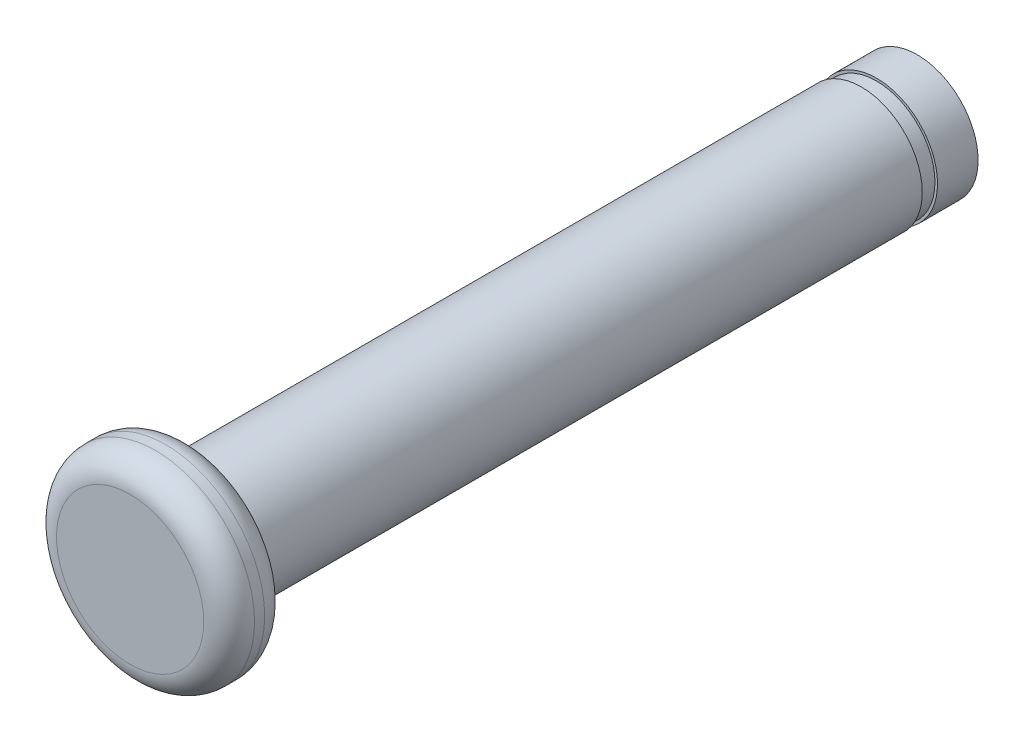
ISO-10303-21;
HEADER;
FILE_DESCRIPTION(('STEP AP214'),'2;1');
FILE_NAME('part.step','',(''),(''),'','','');
FILE_SCHEMA(('AUTOMOTIVE_DESIGN { 1 0 10303 214 1 1 1 1 }'));
ENDSEC;
DATA;
#1=APPLICATION_CONTEXT('core data for automotive mechanical design processes');
#2=APPLICATION_PROTOCOL_DEFINITION('international standard','automotive_design',2000,#1);
#3=PRODUCT_CONTEXT('',#1,'mechanical');
#4=PRODUCT('Part','Part','',(#3));
#5=PRODUCT_RELATED_PRODUCT_CATEGORY('part','',(#4));
#6=PRODUCT_DEFINITION_FORMATION('','',#4);
#7=PRODUCT_DEFINITION_CONTEXT('part definition',#1,'design');
#8=PRODUCT_DEFINITION('design','',#6,#7);
#9=PRODUCT_DEFINITION_SHAPE('','',#8);
#10=(LENGTH_UNIT() NAMED_UNIT(*) SI_UNIT(.MILLI.,.METRE.));
#11=(NAMED_UNIT(*) PLANE_ANGLE_UNIT() SI_UNIT($,.RADIAN.));
#12=(NAMED_UNIT(*) SI_UNIT($,.STERADIAN.) SOLID_ANGLE_UNIT());
#13=UNCERTAINTY_MEASURE_WITH_UNIT(LENGTH_MEASURE(1.E-05),#10,'distance_accuracy_value','');
#14=(GEOMETRIC_REPRESENTATION_CONTEXT(3) GLOBAL_UNCERTAINTY_ASSIGNED_CONTEXT((#13)) GLOBAL_UNIT_ASSIGNED_CONTEXT((#10,
#11,#12)) REPRESENTATION_CONTEXT('',''));
#15=CARTESIAN_POINT('',(0.,0.,0.));
#16=DIRECTION('',(0.,0.,1.));
#17=DIRECTION('',(1.,0.,0.));
#18=AXIS2_PLACEMENT_3D('',#15,#16,#17);
#19=CARTESIAN_POINT('',(0.,0.,-18.288));
#20=DIRECTION('',(0.,0.,-1.));
#21=DIRECTION('',(-1.,0.,0.));
#22=AXIS2_PLACEMENT_3D('',#19,#20,#21);
#23=PLANE('',#22);
#24=CARTESIAN_POINT('',(0.,0.,-18.288));
#25=DIRECTION('',(0.,0.,-1.));
#26=DIRECTION('',(-1.,0.,0.));
#27=AXIS2_PLACEMENT_3D('',#24,#25,#26);
#28=CIRCLE('',#27,1.524);
#29=CARTESIAN_POINT('',(-1.524,0.,-18.288));
#30=VERTEX_POINT('',#29);
#31=EDGE_CURVE('E53',#30,#30,#28,.T.);
#32=ORIENTED_EDGE('',*,*,#31,.T.);
#33=EDGE_LOOP('',(#32));
#34=FACE_BOUND('',#33,.T.);
#35=CARTESIAN_POINT('',(0.,0.,-18.288));
#36=DIRECTION('',(0.,0.,-1.));
#37=DIRECTION('',(-1.,0.,0.));
#38=AXIS2_PLACEMENT_3D('',#35,#36,#37);
#39=CIRCLE('',#38,1.4605);
#40=CARTESIAN_POINT('',(1.4605,0.,-18.288));
#41=VERTEX_POINT('',#40);
#42=EDGE_CURVE('E57',#41,#41,#39,.T.);
#43=ORIENTED_EDGE('',*,*,#42,.F.);
#44=EDGE_LOOP('',(#43));
#45=FACE_BOUND('',#44,.T.);
#46=ADVANCED_FACE('F30',(#34,#45),#23,.T.);
#47=CARTESIAN_POINT('',(0.,0.,-19.685));
#48=DIRECTION('',(0.,0.,1.));
#49=DIRECTION('',(1.,0.,0.));
#50=AXIS2_PLACEMENT_3D('',#47,#48,#49);
#51=CYLINDRICAL_SURFACE('',#50,1.524);
#52=CARTESIAN_POINT('',(0.,0.,-1.524));
#53=DIRECTION('',(0.,0.,1.));
#54=DIRECTION('',(1.,0.,0.));
#55=AXIS2_PLACEMENT_3D('',#52,#53,#54);
#56=CIRCLE('',#55,1.524);
#57=CARTESIAN_POINT('',(1.524,0.,-1.524));
#58=VERTEX_POINT('',#57);
#59=EDGE_CURVE('E50',#58,#58,#56,.F.);
#60=ORIENTED_EDGE('',*,*,#59,.T.);
#61=EDGE_LOOP('',(#60));
#62=FACE_BOUND('',#61,.T.);
#63=ORIENTED_EDGE('',*,*,#31,.F.);
#64=EDGE_LOOP('',(#63));
#65=FACE_BOUND('',#64,.T.);
#66=ADVANCED_FACE('F91',(#62,#65),#51,.T.);
#67=CARTESIAN_POINT('',(0.,0.,-1.524));
#68=DIRECTION('',(0.,0.,1.));
#69=DIRECTION('',(1.,0.,0.));
#70=AXIS2_PLACEMENT_3D('',#67,#68,#69);
#71=PLANE('',#70);
#72=CARTESIAN_POINT('',(0.,0.,-1.524));
#73=DIRECTION('',(0.,0.,1.));
#74=DIRECTION('',(1.,0.,0.));
#75=AXIS2_PLACEMENT_3D('',#72,#73,#74);
#76=CIRCLE('',#75,1.8415);
#77=CARTESIAN_POINT('',(1.8415,0.,-1.524));
#78=VERTEX_POINT('',#77);
#79=EDGE_CURVE('E10',#78,#78,#76,.F.);
#80=ORIENTED_EDGE('',*,*,#79,.T.);
#81=EDGE_LOOP('',(#80));
#82=FACE_BOUND('',#81,.T.);
#83=ORIENTED_EDGE('',*,*,#59,.F.);
#84=EDGE_LOOP('',(#83));
#85=FACE_BOUND('',#84,.T.);
#86=ADVANCED_FACE('F97',(#82,#85),#71,.F.);
#87=CARTESIAN_POINT('',(0.,0.,-1.524));
#88=DIRECTION('',(0.,0.,1.));
#89=DIRECTION('',(1.,0.,0.));
#90=AXIS2_PLACEMENT_3D('',#87,#88,#89);
#91=CYLINDRICAL_SURFACE('',#90,2.4765);
#92=CARTESIAN_POINT('',(0.,0.,-0.635));
#93=DIRECTION('',(0.,0.,1.));
#94=DIRECTION('',(1.,0.,0.));
#95=AXIS2_PLACEMENT_3D('',#92,#93,#94);
#96=CIRCLE('',#95,2.4765);
#97=CARTESIAN_POINT('',(2.4765,0.,-0.635));
#98=VERTEX_POINT('',#97);
#99=EDGE_CURVE('E37',#98,#98,#96,.F.);
#100=CARTESIAN_POINT('',(0.,0.,-0.889));
#101=DIRECTION('',(0.,0.,1.));
#102=DIRECTION('',(1.,0.,0.));
#103=AXIS2_PLACEMENT_3D('',#100,#101,#102);
#104=CIRCLE('',#103,2.4765);
#105=CARTESIAN_POINT('',(2.4765,0.,-0.889));
#106=VERTEX_POINT('',#105);
#107=EDGE_CURVE('E41',#106,#106,#104,.T.);
#108=CARTESIAN_POINT('',(2.4765,0.,-0.635));
#109=CARTESIAN_POINT('',(2.4765,0.,-0.637645833333333));
#110=CARTESIAN_POINT('',(2.4765,0.,-0.640291666666667));
#111=CARTESIAN_POINT('',(2.4765,0.,-0.645583333333333));
#112=CARTESIAN_POINT('',(2.4765,0.,-0.648229166666667));
#113=CARTESIAN_POINT('',(2.4765,0.,-0.653520833333333));
#114=CARTESIAN_POINT('',(2.4765,0.,-0.656166666666667));
#115=CARTESIAN_POINT('',(2.4765,0.,-0.661458333333333));
#116=CARTESIAN_POINT('',(2.4765,0.,-0.664104166666667));
#117=CARTESIAN_POINT('',(2.4765,0.,-0.669395833333333));
#118=CARTESIAN_POINT('',(2.4765,0.,-0.672041666666667));
#119=CARTESIAN_POINT('',(2.4765,0.,-0.677333333333333));
#120=CARTESIAN_POINT('',(2.4765,0.,-0.679979166666667));
#121=CARTESIAN_POINT('',(2.4765,0.,-0.685270833333333));
#122=CARTESIAN_POINT('',(2.4765,0.,-0.687916666666667));
#123=CARTESIAN_POINT('',(2.4765,0.,-0.693208333333333));
#124=CARTESIAN_POINT('',(2.4765,0.,-0.695854166666667));
#125=CARTESIAN_POINT('',(2.4765,0.,-0.701145833333333));
#126=CARTESIAN_POINT('',(2.4765,0.,-0.703791666666667));
#127=CARTESIAN_POINT('',(2.4765,0.,-0.709083333333333));
#128=CARTESIAN_POINT('',(2.4765,0.,-0.711729166666667));
#129=CARTESIAN_POINT('',(2.4765,0.,-0.717020833333333));
#130=CARTESIAN_POINT('',(2.4765,0.,-0.719666666666667));
#131=CARTESIAN_POINT('',(2.4765,0.,-0.724958333333333));
#132=CARTESIAN_POINT('',(2.4765,0.,-0.727604166666667));
#133=CARTESIAN_POINT('',(2.4765,0.,-0.732895833333333));
#134=CARTESIAN_POINT('',(2.4765,0.,-0.735541666666667));
#135=CARTESIAN_POINT('',(2.4765,0.,-0.740833333333333));
#136=CARTESIAN_POINT('',(2.4765,0.,-0.743479166666667));
#137=CARTESIAN_POINT('',(2.4765,0.,-0.748770833333333));
#138=CARTESIAN_POINT('',(2.4765,0.,-0.751416666666667));
#139=CARTESIAN_POINT('',(2.4765,0.,-0.756708333333333));
#140=CARTESIAN_POINT('',(2.4765,0.,-0.759354166666667));
#141=CARTESIAN_POINT('',(2.4765,0.,-0.764645833333333));
#142=CARTESIAN_POINT('',(2.4765,0.,-0.767291666666667));
#143=CARTESIAN_POINT('',(2.4765,0.,-0.772583333333333));
#144=CARTESIAN_POINT('',(2.4765,0.,-0.775229166666667));
#145=CARTESIAN_POINT('',(2.4765,0.,-0.780520833333333));
#146=CARTESIAN_POINT('',(2.4765,0.,-0.783166666666667));
#147=CARTESIAN_POINT('',(2.4765,0.,-0.788458333333333));
#148=CARTESIAN_POINT('',(2.4765,0.,-0.791104166666667));
#149=CARTESIAN_POINT('',(2.4765,0.,-0.796395833333333));
#150=CARTESIAN_POINT('',(2.4765,0.,-0.799041666666667));
#151=CARTESIAN_POINT('',(2.4765,0.,-0.804333333333333));
#152=CARTESIAN_POINT('',(2.4765,0.,-0.806979166666667));
#153=CARTESIAN_POINT('',(2.4765,0.,-0.812270833333333));
#154=CARTESIAN_POINT('',(2.4765,0.,-0.814916666666667));
#155=CARTESIAN_POINT('',(2.4765,0.,-0.820208333333333));
#156=CARTESIAN_POINT('',(2.4765,0.,-0.822854166666667));
#157=CARTESIAN_POINT('',(2.4765,0.,-0.828145833333333));
#158=CARTESIAN_POINT('',(2.4765,0.,-0.830791666666667));
#159=CARTESIAN_POINT('',(2.4765,0.,-0.836083333333333));
#160=CARTESIAN_POINT('',(2.4765,0.,-0.838729166666667));
#161=CARTESIAN_POINT('',(2.4765,0.,-0.844020833333333));
#162=CARTESIAN_POINT('',(2.4765,0.,-0.846666666666667));
#163=CARTESIAN_POINT('',(2.4765,0.,-0.851958333333333));
#164=CARTESIAN_POINT('',(2.4765,0.,-0.854604166666667));
#165=CARTESIAN_POINT('',(2.4765,0.,-0.859895833333333));
#166=CARTESIAN_POINT('',(2.4765,0.,-0.862541666666667));
#167=CARTESIAN_POINT('',(2.4765,0.,-0.867833333333333));
#168=CARTESIAN_POINT('',(2.4765,0.,-0.870479166666667));
#169=CARTESIAN_POINT('',(2.4765,0.,-0.875770833333333));
#170=CARTESIAN_POINT('',(2.4765,0.,-0.878416666666667));
#171=CARTESIAN_POINT('',(2.4765,0.,-0.883708333333333));
#172=CARTESIAN_POINT('',(2.4765,0.,-0.886354166666667));
#173=CARTESIAN_POINT('',(2.4765,0.,-0.889));
#174=B_SPLINE_CURVE_WITH_KNOTS('',3,(#108,#109,#110,#111,#112,#113,#114,#115,#116,#117,#118,
#119,#120,#121,#122,#123,#124,#125,#126,#127,#128,#129,#130,#131,#132,#133,#134,#135,#136,#137,
#138,#139,#140,#141,#142,#143,#144,#145,#146,#147,#148,#149,#150,#151,#152,#153,#154,#155,#156,
#157,#158,#159,#160,#161,#162,#163,#164,#165,#166,#167,#168,#169,#170,#171,#172,#173),
.UNSPECIFIED.,.F.,.F.,(4,2,2,2,2,2,2,2,2,2,2,2,2,2,2,2,2,2,2,2,2,2,2,2,2,2,2,2,2,2,2,2,4),(0.,
0.00793750000000002,0.015875,0.0238125,0.03175,0.0396875,0.0476249999999999,0.0555624999999999,
0.0635,0.0714375,0.079375,0.0873124999999999,0.09525,0.1031875,0.111125,0.1190625,0.127,
0.1349375,0.142875,0.1508125,0.15875,0.1666875,0.174625,0.1825625,0.1905,0.1984375,0.206375,
0.2143125,0.22225,0.2301875,0.238125,0.2460625,0.254),.UNSPECIFIED.);
#175=EDGE_CURVE('BSEAM103',#98,#106,#174,.T.);
#176=ORIENTED_EDGE('',*,*,#99,.T.);
#177=ORIENTED_EDGE('',*,*,#107,.T.);
#178=ORIENTED_EDGE('',*,*,#175,.T.);
#179=ORIENTED_EDGE('',*,*,#175,.F.);
#180=EDGE_LOOP('',(#176,#178,#177,#179));
#181=FACE_BOUND('',#180,.T.);
#182=ADVANCED_FACE('F103',(#181),#91,.T.);
#183=CARTESIAN_POINT('',(0.,0.,0.));
#184=DIRECTION('',(0.,0.,1.));
#185=DIRECTION('',(1.,0.,0.));
#186=AXIS2_PLACEMENT_3D('',#183,#184,#185);
#187=PLANE('',#186);
#188=CARTESIAN_POINT('',(0.,0.,0.));
#189=DIRECTION('',(0.,0.,1.));
#190=DIRECTION('',(1.,0.,0.));
#191=AXIS2_PLACEMENT_3D('',#188,#189,#190);
#192=CIRCLE('',#191,1.8415);
#193=CARTESIAN_POINT('',(1.8415,0.,0.));
#194=VERTEX_POINT('',#193);
#195=EDGE_CURVE('E45',#194,#194,#192,.T.);
#196=ORIENTED_EDGE('',*,*,#195,.T.);
#197=EDGE_LOOP('',(#196));
#198=FACE_BOUND('',#197,.T.);
#199=ADVANCED_FACE('F86',(#198),#187,.T.);
#200=CARTESIAN_POINT('',(0.,0.,-18.669));
#201=DIRECTION('',(0.,0.,1.));
#202=DIRECTION('',(1.,0.,0.));
#203=AXIS2_PLACEMENT_3D('',#200,#201,#202);
#204=CYLINDRICAL_SURFACE('',#203,1.4605);
#205=CARTESIAN_POINT('',(0.,0.,-18.669));
#206=DIRECTION('',(0.,0.,-1.));
#207=DIRECTION('',(-1.,0.,0.));
#208=AXIS2_PLACEMENT_3D('',#205,#206,#207);
#209=CIRCLE('',#208,1.4605);
#210=CARTESIAN_POINT('',(1.4605,0.,-18.669));
#211=VERTEX_POINT('',#210);
#212=EDGE_CURVE('E56',#211,#211,#209,.T.);
#213=CARTESIAN_POINT('',(1.4605,0.,-18.669));
#214=CARTESIAN_POINT('',(1.4605,0.,-18.66503125));
#215=CARTESIAN_POINT('',(1.4605,0.,-18.6610625));
#216=CARTESIAN_POINT('',(1.4605,0.,-18.653125));
#217=CARTESIAN_POINT('',(1.4605,0.,-18.64915625));
#218=CARTESIAN_POINT('',(1.4605,0.,-18.64121875));
#219=CARTESIAN_POINT('',(1.4605,0.,-18.63725));
#220=CARTESIAN_POINT('',(1.4605,0.,-18.6293125));
#221=CARTESIAN_POINT('',(1.4605,0.,-18.62534375));
#222=CARTESIAN_POINT('',(1.4605,0.,-18.61740625));
#223=CARTESIAN_POINT('',(1.4605,0.,-18.6134375));
#224=CARTESIAN_POINT('',(1.4605,0.,-18.6055));
#225=CARTESIAN_POINT('',(1.4605,0.,-18.60153125));
#226=CARTESIAN_POINT('',(1.4605,0.,-18.59359375));
#227=CARTESIAN_POINT('',(1.4605,0.,-18.589625));
#228=CARTESIAN_POINT('',(1.4605,0.,-18.5816875));
#229=CARTESIAN_POINT('',(1.4605,0.,-18.57771875));
#230=CARTESIAN_POINT('',(1.4605,0.,-18.56978125));
#231=CARTESIAN_POINT('',(1.4605,0.,-18.5658125));
#232=CARTESIAN_POINT('',(1.4605,0.,-18.557875));
#233=CARTESIAN_POINT('',(1.4605,0.,-18.55390625));
#234=CARTESIAN_POINT('',(1.4605,0.,-18.54596875));
#235=CARTESIAN_POINT('',(1.4605,0.,-18.542));
#236=CARTESIAN_POINT('',(1.4605,0.,-18.5340625));
#237=CARTESIAN_POINT('',(1.4605,0.,-18.53009375));
#238=CARTESIAN_POINT('',(1.4605,0.,-18.52215625));
#239=CARTESIAN_POINT('',(1.4605,0.,-18.5181875));
#240=CARTESIAN_POINT('',(1.4605,0.,-18.51025));
#241=CARTESIAN_POINT('',(1.4605,0.,-18.50628125));
#242=CARTESIAN_POINT('',(1.4605,0.,-18.49834375));
#243=CARTESIAN_POINT('',(1.4605,0.,-18.494375));
#244=CARTESIAN_POINT('',(1.4605,0.,-18.4864375));
#245=CARTESIAN_POINT('',(1.4605,0.,-18.48246875));
#246=CARTESIAN_POINT('',(1.4605,0.,-18.47453125));
#247=CARTESIAN_POINT('',(1.4605,0.,-18.4705625));
#248=CARTESIAN_POINT('',(1.4605,0.,-18.462625));
#249=CARTESIAN_POINT('',(1.4605,0.,-18.45865625));
#250=CARTESIAN_POINT('',(1.4605,0.,-18.45071875));
#251=CARTESIAN_POINT('',(1.4605,0.,-18.44675));
#252=CARTESIAN_POINT('',(1.4605,0.,-18.4388125));
#253=CARTESIAN_POINT('',(1.4605,0.,-18.43484375));
#254=CARTESIAN_POINT('',(1.4605,0.,-18.42690625));
#255=CARTESIAN_POINT('',(1.4605,0.,-18.4229375));
#256=CARTESIAN_POINT('',(1.4605,0.,-18.415));
#257=CARTESIAN_POINT('',(1.4605,0.,-18.41103125));
#258=CARTESIAN_POINT('',(1.4605,0.,-18.40309375));
#259=CARTESIAN_POINT('',(1.4605,0.,-18.399125));
#260=CARTESIAN_POINT('',(1.4605,0.,-18.3911875));
#261=CARTESIAN_POINT('',(1.4605,0.,-18.38721875));
#262=CARTESIAN_POINT('',(1.4605,0.,-18.37928125));
#263=CARTESIAN_POINT('',(1.4605,0.,-18.3753125));
#264=CARTESIAN_POINT('',(1.4605,0.,-18.367375));
#265=CARTESIAN_POINT('',(1.4605,0.,-18.36340625));
#266=CARTESIAN_POINT('',(1.4605,0.,-18.35546875));
#267=CARTESIAN_POINT('',(1.4605,0.,-18.3515));
#268=CARTESIAN_POINT('',(1.4605,0.,-18.3435625));
#269=CARTESIAN_POINT('',(1.4605,0.,-18.33959375));
#270=CARTESIAN_POINT('',(1.4605,0.,-18.33165625));
#271=CARTESIAN_POINT('',(1.4605,0.,-18.3276875));
#272=CARTESIAN_POINT('',(1.4605,0.,-18.31975));
#273=CARTESIAN_POINT('',(1.4605,0.,-18.31578125));
#274=CARTESIAN_POINT('',(1.4605,0.,-18.30784375));
#275=CARTESIAN_POINT('',(1.4605,0.,-18.303875));
#276=CARTESIAN_POINT('',(1.4605,0.,-18.2959375));
#277=CARTESIAN_POINT('',(1.4605,0.,-18.29196875));
#278=CARTESIAN_POINT('',(1.4605,0.,-18.288));
#279=B_SPLINE_CURVE_WITH_KNOTS('',3,(#213,#214,#215,#216,#217,#218,#219,#220,#221,#222,#223,
#224,#225,#226,#227,#228,#229,#230,#231,#232,#233,#234,#235,#236,#237,#238,#239,#240,#241,#242,
#243,#244,#245,#246,#247,#248,#249,#250,#251,#252,#253,#254,#255,#256,#257,#258,#259,#260,#261,
#262,#263,#264,#265,#266,#267,#268,#269,#270,#271,#272,#273,#274,#275,#276,#277,#278),
.UNSPECIFIED.,.F.,.F.,(4,2,2,2,2,2,2,2,2,2,2,2,2,2,2,2,2,2,2,2,2,2,2,2,2,2,2,2,2,2,2,2,4),(0.,
0.0119062499999989,0.0238124999999978,0.0357187499999967,0.0476249999999991,0.059531249999998,
0.0714374999999969,0.0833437499999992,0.0952499999999981,0.107156249999997,0.119062499999999,
0.130968749999998,0.142874999999997,0.15478125,0.166687499999998,0.178593749999997,
0.190499999999996,0.202406249999999,0.214312499999997,0.226218749999996,0.238124999999999,
0.250031249999998,0.261937499999997,0.273843749999999,0.285749999999998,0.297656249999997,
0.309562499999999,0.321468749999998,0.333374999999997,0.345281249999999,0.357187499999998,
0.369093749999997,0.380999999999996),.UNSPECIFIED.);
#280=EDGE_CURVE('BSEAM80',#211,#41,#279,.T.);
#281=ORIENTED_EDGE('',*,*,#212,.F.);
#282=ORIENTED_EDGE('',*,*,#42,.T.);
#283=ORIENTED_EDGE('',*,*,#280,.T.);
#284=ORIENTED_EDGE('',*,*,#280,.F.);
#285=EDGE_LOOP('',(#281,#283,#282,#284));
#286=FACE_BOUND('',#285,.T.);
#287=ADVANCED_FACE('F80',(#286),#204,.T.);
#288=CARTESIAN_POINT('',(0.,0.,-18.669));
#289=DIRECTION('',(0.,0.,-1.));
#290=DIRECTION('',(-1.,0.,0.));
#291=AXIS2_PLACEMENT_3D('',#288,#289,#290);
#292=PLANE('',#291);
#293=CARTESIAN_POINT('',(0.,0.,-18.669));
#294=DIRECTION('',(0.,0.,-1.));
#295=DIRECTION('',(-1.,0.,0.));
#296=AXIS2_PLACEMENT_3D('',#293,#294,#295);
#297=CIRCLE('',#296,1.524);
#298=CARTESIAN_POINT('',(-1.524,0.,-18.669));
#299=VERTEX_POINT('',#298);
#300=EDGE_CURVE('E63',#299,#299,#297,.T.);
#301=ORIENTED_EDGE('',*,*,#300,.F.);
#302=EDGE_LOOP('',(#301));
#303=FACE_BOUND('',#302,.T.);
#304=ORIENTED_EDGE('',*,*,#212,.T.);
#305=EDGE_LOOP('',(#304));
#306=FACE_BOUND('',#305,.T.);
#307=ADVANCED_FACE('F74',(#303,#306),#292,.F.);
#308=CARTESIAN_POINT('',(0.,0.,-19.685));
#309=DIRECTION('',(0.,0.,1.));
#310=DIRECTION('',(1.,0.,0.));
#311=AXIS2_PLACEMENT_3D('',#308,#309,#310);
#312=CYLINDRICAL_SURFACE('',#311,1.524);
#313=CARTESIAN_POINT('',(0.,0.,-19.685));
#314=DIRECTION('',(0.,0.,-1.));
#315=DIRECTION('',(-1.,0.,0.));
#316=AXIS2_PLACEMENT_3D('',#313,#314,#315);
#317=CIRCLE('',#316,1.524);
#318=CARTESIAN_POINT('',(-1.524,0.,-19.685));
#319=VERTEX_POINT('',#318);
#320=EDGE_CURVE('E60',#319,#319,#317,.T.);
#321=ORIENTED_EDGE('',*,*,#320,.F.);
#322=EDGE_LOOP('',(#321));
#323=FACE_BOUND('',#322,.T.);
#324=ORIENTED_EDGE('',*,*,#300,.T.);
#325=EDGE_LOOP('',(#324));
#326=FACE_BOUND('',#325,.T.);
#327=ADVANCED_FACE('F71',(#323,#326),#312,.T.);
#328=CARTESIAN_POINT('',(0.,0.,-19.685));
#329=DIRECTION('',(0.,0.,-1.));
#330=DIRECTION('',(-1.,0.,0.));
#331=AXIS2_PLACEMENT_3D('',#328,#329,#330);
#332=PLANE('',#331);
#333=ORIENTED_EDGE('',*,*,#320,.T.);
#334=EDGE_LOOP('',(#333));
#335=FACE_BOUND('',#334,.T.);
#336=ADVANCED_FACE('F69',(#335),#332,.T.);
#337=CARTESIAN_POINT('',(0.,0.,-0.635));
#338=DIRECTION('',(0.,0.,1.));
#339=DIRECTION('',(1.,0.,0.));
#340=AXIS2_PLACEMENT_3D('',#337,#338,#339);
#341=TOROIDAL_SURFACE('',#340,1.8415,0.635);
#342=ORIENTED_EDGE('',*,*,#99,.F.);
#343=EDGE_LOOP('',(#342));
#344=FACE_BOUND('',#343,.T.);
#345=ORIENTED_EDGE('',*,*,#195,.F.);
#346=EDGE_LOOP('',(#345));
#347=FACE_BOUND('',#346,.T.);
#348=ADVANCED_FACE('F108',(#344,#347),#341,.T.);
#349=CARTESIAN_POINT('',(0.,0.,-0.889));
#350=DIRECTION('',(0.,0.,1.));
#351=DIRECTION('',(1.,0.,0.));
#352=AXIS2_PLACEMENT_3D('',#349,#350,#351);
#353=TOROIDAL_SURFACE('',#352,1.8415,0.635);
#354=ORIENTED_EDGE('',*,*,#79,.F.);
#355=EDGE_LOOP('',(#354));
#356=FACE_BOUND('',#355,.T.);
#357=ORIENTED_EDGE('',*,*,#107,.F.);
#358=EDGE_LOOP('',(#357));
#359=FACE_BOUND('',#358,.T.);
#360=ADVANCED_FACE('F32',(#356,#359),#353,.T.);
#361=CLOSED_SHELL('',(#46,#66,#86,#182,#199,#287,#307,#327,#336,#348,#360));
#362=MANIFOLD_SOLID_BREP('B2',#361);
#363=ADVANCED_BREP_SHAPE_REPRESENTATION('',(#18,#362),#14);
#364=SHAPE_DEFINITION_REPRESENTATION(#9,#363);
ENDSEC;
END-ISO-10303-21;
